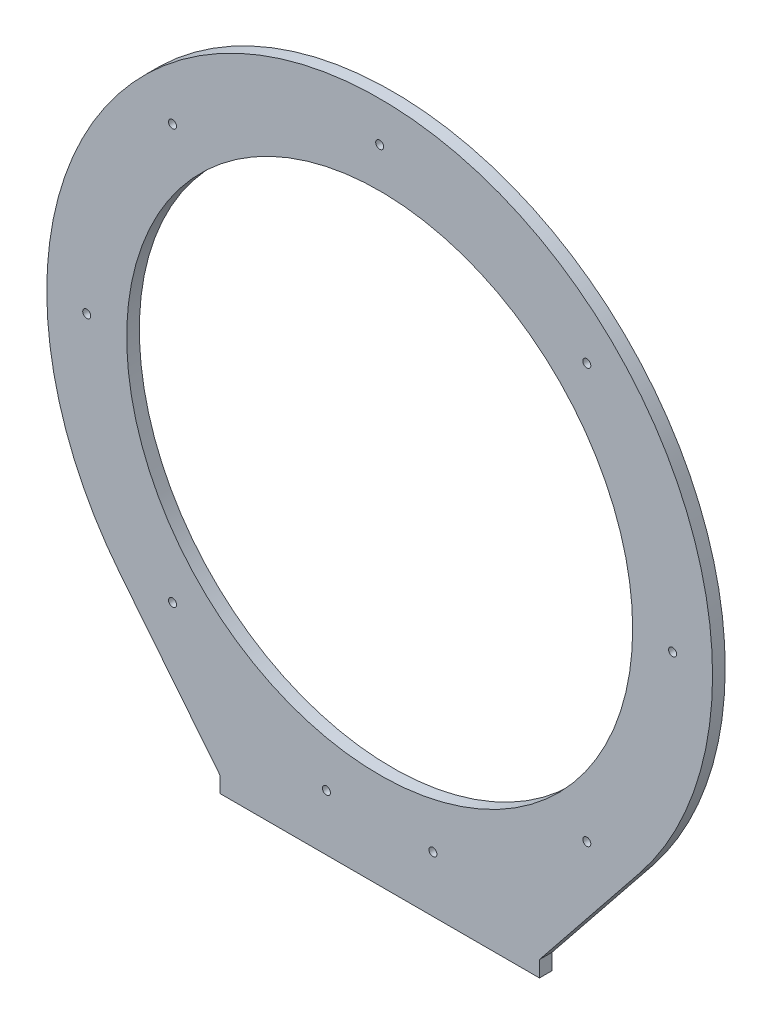
ISO-10303-21;
HEADER;
FILE_DESCRIPTION(('STEP AP214'),'2;1');
FILE_NAME('part.step','',(''),(''),'','','');
FILE_SCHEMA(('AUTOMOTIVE_DESIGN { 1 0 10303 214 1 1 1 1 }'));
ENDSEC;
DATA;
#1=APPLICATION_CONTEXT('core data for automotive mechanical design processes');
#2=APPLICATION_PROTOCOL_DEFINITION('international standard','automotive_design',2000,#1);
#3=PRODUCT_CONTEXT('',#1,'mechanical');
#4=PRODUCT('Part','Part','',(#3));
#5=PRODUCT_RELATED_PRODUCT_CATEGORY('part','',(#4));
#6=PRODUCT_DEFINITION_FORMATION('','',#4);
#7=PRODUCT_DEFINITION_CONTEXT('part definition',#1,'design');
#8=PRODUCT_DEFINITION('design','',#6,#7);
#9=PRODUCT_DEFINITION_SHAPE('','',#8);
#10=(LENGTH_UNIT() NAMED_UNIT(*) SI_UNIT(.MILLI.,.METRE.));
#11=(NAMED_UNIT(*) PLANE_ANGLE_UNIT() SI_UNIT($,.RADIAN.));
#12=(NAMED_UNIT(*) SI_UNIT($,.STERADIAN.) SOLID_ANGLE_UNIT());
#13=UNCERTAINTY_MEASURE_WITH_UNIT(LENGTH_MEASURE(1.E-05),#10,'distance_accuracy_value','');
#14=(GEOMETRIC_REPRESENTATION_CONTEXT(3) GLOBAL_UNCERTAINTY_ASSIGNED_CONTEXT((#13)) GLOBAL_UNIT_ASSIGNED_CONTEXT((#10,
#11,#12)) REPRESENTATION_CONTEXT('',''));
#15=CARTESIAN_POINT('',(0.,0.,0.));
#16=DIRECTION('',(0.,0.,1.));
#17=DIRECTION('',(1.,0.,0.));
#18=AXIS2_PLACEMENT_3D('',#15,#16,#17);
#19=CARTESIAN_POINT('',(97.5292587776334,-78.185955786736,4.75));
#20=DIRECTION('',(-0.780234070221067,0.625487646293888,0.));
#21=DIRECTION('',(-0.625487646293888,-0.780234070221067,0.));
#22=AXIS2_PLACEMENT_3D('',#19,#20,#21);
#23=PLANE('',#22);
#24=DIRECTION('',(0.625487646293888,0.780234070221067,0.));
#25=VECTOR('',#24,1.);
#26=CARTESIAN_POINT('',(97.5292587776334,-78.185955786736,0.));
#27=LINE('',#26,#25);
#28=CARTESIAN_POINT('',(60.0000000000001,-125.,0.));
#29=VERTEX_POINT('',#28);
#30=CARTESIAN_POINT('',(97.5292587776333,-78.1859557867361,0.));
#31=VERTEX_POINT('',#30);
#32=EDGE_CURVE('E162',#29,#31,#27,.T.);
#33=ORIENTED_EDGE('',*,*,#32,.T.);
#34=DIRECTION('',(0.,0.,-1.));
#35=VECTOR('',#34,1.);
#36=CARTESIAN_POINT('',(97.5292587776333,-78.1859557867361,4.75));
#37=LINE('',#36,#35);
#38=CARTESIAN_POINT('',(97.5292587776333,-78.1859557867361,4.75));
#39=VERTEX_POINT('',#38);
#40=EDGE_CURVE('E11',#39,#31,#37,.T.);
#41=ORIENTED_EDGE('',*,*,#40,.F.);
#42=DIRECTION('',(0.625487646293888,0.780234070221067,0.));
#43=VECTOR('',#42,1.);
#44=CARTESIAN_POINT('',(97.5292587776334,-78.185955786736,4.75));
#45=LINE('',#44,#43);
#46=CARTESIAN_POINT('',(60.0000000000001,-125.,4.75));
#47=VERTEX_POINT('',#46);
#48=EDGE_CURVE('E206',#47,#39,#45,.T.);
#49=ORIENTED_EDGE('',*,*,#48,.F.);
#50=DIRECTION('',(0.,0.,-1.));
#51=VECTOR('',#50,1.);
#52=CARTESIAN_POINT('',(60.0000000000001,-125.,4.75));
#53=LINE('',#52,#51);
#54=EDGE_CURVE('E63',#47,#29,#53,.T.);
#55=ORIENTED_EDGE('',*,*,#54,.T.);
#56=EDGE_LOOP('',(#33,#41,#49,#55));
#57=FACE_BOUND('',#56,.T.);
#58=ADVANCED_FACE('F47',(#57),#23,.F.);
#59=CARTESIAN_POINT('',(0.,0.,4.75));
#60=DIRECTION('',(0.,0.,-1.));
#61=DIRECTION('',(-1.,0.,0.));
#62=AXIS2_PLACEMENT_3D('',#59,#60,#61);
#63=CYLINDRICAL_SURFACE('',#62,125.);
#64=CARTESIAN_POINT('',(0.,0.,0.));
#65=DIRECTION('',(0.,0.,1.));
#66=DIRECTION('',(1.,0.,0.));
#67=AXIS2_PLACEMENT_3D('',#64,#65,#66);
#68=CIRCLE('',#67,125.);
#69=CARTESIAN_POINT('',(-97.5292587776333,-78.1859557867361,0.));
#70=VERTEX_POINT('',#69);
#71=EDGE_CURVE('E164',#31,#70,#68,.T.);
#72=ORIENTED_EDGE('',*,*,#71,.T.);
#73=DIRECTION('',(0.,0.,-1.));
#74=VECTOR('',#73,1.);
#75=CARTESIAN_POINT('',(-97.5292587776333,-78.1859557867361,4.75));
#76=LINE('',#75,#74);
#77=CARTESIAN_POINT('',(-97.5292587776333,-78.1859557867361,4.75));
#78=VERTEX_POINT('',#77);
#79=EDGE_CURVE('E55',#78,#70,#76,.T.);
#80=ORIENTED_EDGE('',*,*,#79,.F.);
#81=CARTESIAN_POINT('',(0.,0.,4.75));
#82=DIRECTION('',(0.,0.,1.));
#83=DIRECTION('',(1.,0.,0.));
#84=AXIS2_PLACEMENT_3D('',#81,#82,#83);
#85=CIRCLE('',#84,125.);
#86=EDGE_CURVE('E96',#39,#78,#85,.T.);
#87=ORIENTED_EDGE('',*,*,#86,.F.);
#88=ORIENTED_EDGE('',*,*,#40,.T.);
#89=EDGE_LOOP('',(#72,#80,#87,#88));
#90=FACE_BOUND('',#89,.T.);
#91=ADVANCED_FACE('F212',(#90),#63,.T.);
#92=CARTESIAN_POINT('',(-97.5292587776332,-78.1859557867361,4.75));
#93=DIRECTION('',(-0.780234070221066,-0.625487646293889,0.));
#94=DIRECTION('',(0.625487646293889,-0.780234070221066,0.));
#95=AXIS2_PLACEMENT_3D('',#92,#93,#94);
#96=PLANE('',#95);
#97=DIRECTION('',(-0.625487646293889,0.780234070221066,0.));
#98=VECTOR('',#97,1.);
#99=CARTESIAN_POINT('',(-97.5292587776332,-78.1859557867361,0.));
#100=LINE('',#99,#98);
#101=CARTESIAN_POINT('',(-59.9999999999999,-125.,0.));
#102=VERTEX_POINT('',#101);
#103=EDGE_CURVE('E167',#102,#70,#100,.T.);
#104=ORIENTED_EDGE('',*,*,#103,.F.);
#105=DIRECTION('',(0.,0.,-1.));
#106=VECTOR('',#105,1.);
#107=CARTESIAN_POINT('',(-59.9999999999999,-125.,4.75));
#108=LINE('',#107,#106);
#109=CARTESIAN_POINT('',(-59.9999999999999,-125.,4.75));
#110=VERTEX_POINT('',#109);
#111=EDGE_CURVE('E124',#110,#102,#108,.T.);
#112=ORIENTED_EDGE('',*,*,#111,.F.);
#113=DIRECTION('',(-0.625487646293889,0.780234070221066,0.));
#114=VECTOR('',#113,1.);
#115=CARTESIAN_POINT('',(-97.5292587776332,-78.1859557867361,4.75));
#116=LINE('',#115,#114);
#117=EDGE_CURVE('E114',#110,#78,#116,.T.);
#118=ORIENTED_EDGE('',*,*,#117,.T.);
#119=ORIENTED_EDGE('',*,*,#79,.T.);
#120=EDGE_LOOP('',(#104,#112,#118,#119));
#121=FACE_BOUND('',#120,.T.);
#122=ADVANCED_FACE('F211',(#121),#96,.T.);
#123=CARTESIAN_POINT('',(-59.9999999999999,0.,4.75));
#124=DIRECTION('',(1.,0.,0.));
#125=DIRECTION('',(0.,0.,-1.));
#126=AXIS2_PLACEMENT_3D('',#123,#124,#125);
#127=PLANE('',#126);
#128=DIRECTION('',(0.,-1.,0.));
#129=VECTOR('',#128,1.);
#130=CARTESIAN_POINT('',(-59.9999999999999,0.,0.));
#131=LINE('',#130,#129);
#132=CARTESIAN_POINT('',(-59.9999999999999,-131.,0.));
#133=VERTEX_POINT('',#132);
#134=EDGE_CURVE('E121',#102,#133,#131,.T.);
#135=ORIENTED_EDGE('',*,*,#134,.T.);
#136=DIRECTION('',(0.,0.,-1.));
#137=VECTOR('',#136,1.);
#138=CARTESIAN_POINT('',(-59.9999999999999,-131.,4.75));
#139=LINE('',#138,#137);
#140=CARTESIAN_POINT('',(-59.9999999999999,-131.,4.75));
#141=VERTEX_POINT('',#140);
#142=EDGE_CURVE('E118',#141,#133,#139,.T.);
#143=ORIENTED_EDGE('',*,*,#142,.F.);
#144=DIRECTION('',(0.,-1.,0.));
#145=VECTOR('',#144,1.);
#146=CARTESIAN_POINT('',(-59.9999999999999,0.,4.75));
#147=LINE('',#146,#145);
#148=EDGE_CURVE('E106',#110,#141,#147,.T.);
#149=ORIENTED_EDGE('',*,*,#148,.F.);
#150=ORIENTED_EDGE('',*,*,#111,.T.);
#151=EDGE_LOOP('',(#135,#143,#149,#150));
#152=FACE_BOUND('',#151,.T.);
#153=ADVANCED_FACE('F119',(#152),#127,.F.);
#154=CARTESIAN_POINT('',(0.,-131.,4.75));
#155=DIRECTION('',(0.,1.,0.));
#156=DIRECTION('',(0.,0.,1.));
#157=AXIS2_PLACEMENT_3D('',#154,#155,#156);
#158=PLANE('',#157);
#159=DIRECTION('',(1.,0.,0.));
#160=VECTOR('',#159,1.);
#161=CARTESIAN_POINT('',(0.,-131.,0.));
#162=LINE('',#161,#160);
#163=CARTESIAN_POINT('',(60.0000000000001,-131.,0.));
#164=VERTEX_POINT('',#163);
#165=EDGE_CURVE('E171',#133,#164,#162,.T.);
#166=ORIENTED_EDGE('',*,*,#165,.T.);
#167=DIRECTION('',(0.,0.,-1.));
#168=VECTOR('',#167,1.);
#169=CARTESIAN_POINT('',(60.0000000000001,-131.,4.75));
#170=LINE('',#169,#168);
#171=CARTESIAN_POINT('',(60.0000000000001,-131.,4.75));
#172=VERTEX_POINT('',#171);
#173=EDGE_CURVE('E84',#172,#164,#170,.T.);
#174=ORIENTED_EDGE('',*,*,#173,.F.);
#175=DIRECTION('',(1.,0.,0.));
#176=VECTOR('',#175,1.);
#177=CARTESIAN_POINT('',(0.,-131.,4.75));
#178=LINE('',#177,#176);
#179=EDGE_CURVE('E112',#141,#172,#178,.T.);
#180=ORIENTED_EDGE('',*,*,#179,.F.);
#181=ORIENTED_EDGE('',*,*,#142,.T.);
#182=EDGE_LOOP('',(#166,#174,#180,#181));
#183=FACE_BOUND('',#182,.T.);
#184=ADVANCED_FACE('F126',(#183),#158,.F.);
#185=CARTESIAN_POINT('',(-77.7817459305202,-77.7817459305202,4.75));
#186=DIRECTION('',(0.,0.,-1.));
#187=DIRECTION('',(-1.,0.,0.));
#188=AXIS2_PLACEMENT_3D('',#185,#186,#187);
#189=CYLINDRICAL_SURFACE('',#188,1.49999999999997);
#190=CARTESIAN_POINT('',(-77.7817459305202,-77.7817459305202,4.75));
#191=DIRECTION('',(0.,0.,1.));
#192=DIRECTION('',(1.,0.,0.));
#193=AXIS2_PLACEMENT_3D('',#190,#191,#192);
#194=CIRCLE('',#193,1.49999999999997);
#195=CARTESIAN_POINT('',(-76.2817459305202,-77.7817459305202,4.75));
#196=VERTEX_POINT('',#195);
#197=EDGE_CURVE('E156',#196,#196,#194,.F.);
#198=ORIENTED_EDGE('',*,*,#197,.F.);
#199=EDGE_LOOP('',(#198));
#200=FACE_BOUND('',#199,.T.);
#201=CARTESIAN_POINT('',(-77.7817459305202,-77.7817459305202,0.));
#202=DIRECTION('',(0.,0.,1.));
#203=DIRECTION('',(1.,0.,0.));
#204=AXIS2_PLACEMENT_3D('',#201,#202,#203);
#205=CIRCLE('',#204,1.49999999999997);
#206=CARTESIAN_POINT('',(-76.2817459305202,-77.7817459305202,0.));
#207=VERTEX_POINT('',#206);
#208=EDGE_CURVE('E200',#207,#207,#205,.F.);
#209=ORIENTED_EDGE('',*,*,#208,.T.);
#210=EDGE_LOOP('',(#209));
#211=FACE_BOUND('',#210,.T.);
#212=ADVANCED_FACE('F245',(#200,#211),#189,.F.);
#213=CARTESIAN_POINT('',(77.7817459305202,77.7817459305202,4.75));
#214=DIRECTION('',(0.,0.,-1.));
#215=DIRECTION('',(-1.,0.,0.));
#216=AXIS2_PLACEMENT_3D('',#213,#214,#215);
#217=CYLINDRICAL_SURFACE('',#216,1.5);
#218=CARTESIAN_POINT('',(77.7817459305202,77.7817459305202,4.75));
#219=DIRECTION('',(0.,0.,1.));
#220=DIRECTION('',(1.,0.,0.));
#221=AXIS2_PLACEMENT_3D('',#218,#219,#220);
#222=CIRCLE('',#221,1.5);
#223=CARTESIAN_POINT('',(79.2817459305202,77.7817459305202,4.75));
#224=VERTEX_POINT('',#223);
#225=EDGE_CURVE('E153',#224,#224,#222,.T.);
#226=ORIENTED_EDGE('',*,*,#225,.T.);
#227=EDGE_LOOP('',(#226));
#228=FACE_BOUND('',#227,.T.);
#229=CARTESIAN_POINT('',(77.7817459305202,77.7817459305202,0.));
#230=DIRECTION('',(0.,0.,1.));
#231=DIRECTION('',(1.,0.,0.));
#232=AXIS2_PLACEMENT_3D('',#229,#230,#231);
#233=CIRCLE('',#232,1.5);
#234=CARTESIAN_POINT('',(79.2817459305202,77.7817459305202,0.));
#235=VERTEX_POINT('',#234);
#236=EDGE_CURVE('E197',#235,#235,#233,.T.);
#237=ORIENTED_EDGE('',*,*,#236,.F.);
#238=EDGE_LOOP('',(#237));
#239=FACE_BOUND('',#238,.T.);
#240=ADVANCED_FACE('F249',(#228,#239),#217,.F.);
#241=CARTESIAN_POINT('',(77.7817459305203,-77.7817459305202,4.75));
#242=DIRECTION('',(0.,0.,-1.));
#243=DIRECTION('',(-1.,0.,0.));
#244=AXIS2_PLACEMENT_3D('',#241,#242,#243);
#245=CYLINDRICAL_SURFACE('',#244,1.5);
#246=CARTESIAN_POINT('',(77.7817459305203,-77.7817459305202,4.75));
#247=DIRECTION('',(0.,0.,1.));
#248=DIRECTION('',(1.,0.,0.));
#249=AXIS2_PLACEMENT_3D('',#246,#247,#248);
#250=CIRCLE('',#249,1.5);
#251=CARTESIAN_POINT('',(79.2817459305203,-77.7817459305202,4.75));
#252=VERTEX_POINT('',#251);
#253=EDGE_CURVE('E150',#252,#252,#250,.T.);
#254=ORIENTED_EDGE('',*,*,#253,.T.);
#255=EDGE_LOOP('',(#254));
#256=FACE_BOUND('',#255,.T.);
#257=CARTESIAN_POINT('',(77.7817459305203,-77.7817459305202,0.));
#258=DIRECTION('',(0.,0.,1.));
#259=DIRECTION('',(1.,0.,0.));
#260=AXIS2_PLACEMENT_3D('',#257,#258,#259);
#261=CIRCLE('',#260,1.5);
#262=CARTESIAN_POINT('',(79.2817459305203,-77.7817459305202,0.));
#263=VERTEX_POINT('',#262);
#264=EDGE_CURVE('E194',#263,#263,#261,.T.);
#265=ORIENTED_EDGE('',*,*,#264,.F.);
#266=EDGE_LOOP('',(#265));
#267=FACE_BOUND('',#266,.T.);
#268=ADVANCED_FACE('F255',(#256,#267),#245,.F.);
#269=CARTESIAN_POINT('',(0.,110.,4.75));
#270=DIRECTION('',(0.,0.,-1.));
#271=DIRECTION('',(-1.,0.,0.));
#272=AXIS2_PLACEMENT_3D('',#269,#270,#271);
#273=CYLINDRICAL_SURFACE('',#272,1.5);
#274=CARTESIAN_POINT('',(0.,110.,4.75));
#275=DIRECTION('',(0.,0.,1.));
#276=DIRECTION('',(1.,0.,0.));
#277=AXIS2_PLACEMENT_3D('',#274,#275,#276);
#278=CIRCLE('',#277,1.5);
#279=CARTESIAN_POINT('',(1.5,110.,4.75));
#280=VERTEX_POINT('',#279);
#281=EDGE_CURVE('E147',#280,#280,#278,.F.);
#282=ORIENTED_EDGE('',*,*,#281,.F.);
#283=EDGE_LOOP('',(#282));
#284=FACE_BOUND('',#283,.T.);
#285=CARTESIAN_POINT('',(0.,110.,0.));
#286=DIRECTION('',(0.,0.,1.));
#287=DIRECTION('',(1.,0.,0.));
#288=AXIS2_PLACEMENT_3D('',#285,#286,#287);
#289=CIRCLE('',#288,1.5);
#290=CARTESIAN_POINT('',(1.5,110.,0.));
#291=VERTEX_POINT('',#290);
#292=EDGE_CURVE('E191',#291,#291,#289,.F.);
#293=ORIENTED_EDGE('',*,*,#292,.T.);
#294=EDGE_LOOP('',(#293));
#295=FACE_BOUND('',#294,.T.);
#296=ADVANCED_FACE('F264',(#284,#295),#273,.F.);
#297=CARTESIAN_POINT('',(110.,0.,4.75));
#298=DIRECTION('',(0.,0.,-1.));
#299=DIRECTION('',(-1.,0.,0.));
#300=AXIS2_PLACEMENT_3D('',#297,#298,#299);
#301=CYLINDRICAL_SURFACE('',#300,1.5);
#302=CARTESIAN_POINT('',(110.,0.,4.75));
#303=DIRECTION('',(0.,0.,1.));
#304=DIRECTION('',(1.,0.,0.));
#305=AXIS2_PLACEMENT_3D('',#302,#303,#304);
#306=CIRCLE('',#305,1.5);
#307=CARTESIAN_POINT('',(111.5,0.,4.75));
#308=VERTEX_POINT('',#307);
#309=EDGE_CURVE('E144',#308,#308,#306,.T.);
#310=ORIENTED_EDGE('',*,*,#309,.T.);
#311=EDGE_LOOP('',(#310));
#312=FACE_BOUND('',#311,.T.);
#313=CARTESIAN_POINT('',(110.,0.,0.));
#314=DIRECTION('',(0.,0.,1.));
#315=DIRECTION('',(1.,0.,0.));
#316=AXIS2_PLACEMENT_3D('',#313,#314,#315);
#317=CIRCLE('',#316,1.5);
#318=CARTESIAN_POINT('',(111.5,0.,0.));
#319=VERTEX_POINT('',#318);
#320=EDGE_CURVE('E188',#319,#319,#317,.T.);
#321=ORIENTED_EDGE('',*,*,#320,.F.);
#322=EDGE_LOOP('',(#321));
#323=FACE_BOUND('',#322,.T.);
#324=ADVANCED_FACE('F268',(#312,#323),#301,.F.);
#325=CARTESIAN_POINT('',(-110.,0.,4.75));
#326=DIRECTION('',(0.,0.,-1.));
#327=DIRECTION('',(-1.,0.,0.));
#328=AXIS2_PLACEMENT_3D('',#325,#326,#327);
#329=CYLINDRICAL_SURFACE('',#328,1.5);
#330=CARTESIAN_POINT('',(-110.,0.,4.75));
#331=DIRECTION('',(0.,0.,1.));
#332=DIRECTION('',(1.,0.,0.));
#333=AXIS2_PLACEMENT_3D('',#330,#331,#332);
#334=CIRCLE('',#333,1.5);
#335=CARTESIAN_POINT('',(-108.5,0.,4.75));
#336=VERTEX_POINT('',#335);
#337=EDGE_CURVE('E141',#336,#336,#334,.F.);
#338=ORIENTED_EDGE('',*,*,#337,.F.);
#339=EDGE_LOOP('',(#338));
#340=FACE_BOUND('',#339,.T.);
#341=CARTESIAN_POINT('',(-110.,0.,0.));
#342=DIRECTION('',(0.,0.,1.));
#343=DIRECTION('',(1.,0.,0.));
#344=AXIS2_PLACEMENT_3D('',#341,#342,#343);
#345=CIRCLE('',#344,1.5);
#346=CARTESIAN_POINT('',(-108.5,0.,0.));
#347=VERTEX_POINT('',#346);
#348=EDGE_CURVE('E185',#347,#347,#345,.F.);
#349=ORIENTED_EDGE('',*,*,#348,.T.);
#350=EDGE_LOOP('',(#349));
#351=FACE_BOUND('',#350,.T.);
#352=ADVANCED_FACE('F272',(#340,#351),#329,.F.);
#353=CARTESIAN_POINT('',(0.,0.,4.75));
#354=DIRECTION('',(0.,0.,-1.));
#355=DIRECTION('',(-1.,0.,0.));
#356=AXIS2_PLACEMENT_3D('',#353,#354,#355);
#357=CYLINDRICAL_SURFACE('',#356,95.);
#358=CARTESIAN_POINT('',(0.,0.,4.75));
#359=DIRECTION('',(0.,0.,1.));
#360=DIRECTION('',(1.,0.,0.));
#361=AXIS2_PLACEMENT_3D('',#358,#359,#360);
#362=CIRCLE('',#361,95.);
#363=CARTESIAN_POINT('',(95.,0.,4.75));
#364=VERTEX_POINT('',#363);
#365=EDGE_CURVE('E138',#364,#364,#362,.T.);
#366=ORIENTED_EDGE('',*,*,#365,.T.);
#367=EDGE_LOOP('',(#366));
#368=FACE_BOUND('',#367,.T.);
#369=CARTESIAN_POINT('',(0.,0.,0.));
#370=DIRECTION('',(0.,0.,1.));
#371=DIRECTION('',(1.,0.,0.));
#372=AXIS2_PLACEMENT_3D('',#369,#370,#371);
#373=CIRCLE('',#372,95.);
#374=CARTESIAN_POINT('',(95.,0.,0.));
#375=VERTEX_POINT('',#374);
#376=EDGE_CURVE('E182',#375,#375,#373,.T.);
#377=ORIENTED_EDGE('',*,*,#376,.F.);
#378=EDGE_LOOP('',(#377));
#379=FACE_BOUND('',#378,.T.);
#380=ADVANCED_FACE('F276',(#368,#379),#357,.F.);
#381=CARTESIAN_POINT('',(-19.9999999999995,-110.,4.75));
#382=DIRECTION('',(0.,0.,-1.));
#383=DIRECTION('',(-1.,0.,0.));
#384=AXIS2_PLACEMENT_3D('',#381,#382,#383);
#385=CYLINDRICAL_SURFACE('',#384,1.5);
#386=CARTESIAN_POINT('',(-19.9999999999995,-110.,4.75));
#387=DIRECTION('',(0.,0.,1.));
#388=DIRECTION('',(1.,0.,0.));
#389=AXIS2_PLACEMENT_3D('',#386,#387,#388);
#390=CIRCLE('',#389,1.5);
#391=CARTESIAN_POINT('',(-18.4999999999995,-110.,4.75));
#392=VERTEX_POINT('',#391);
#393=EDGE_CURVE('E135',#392,#392,#390,.T.);
#394=ORIENTED_EDGE('',*,*,#393,.T.);
#395=EDGE_LOOP('',(#394));
#396=FACE_BOUND('',#395,.T.);
#397=CARTESIAN_POINT('',(-19.9999999999995,-110.,0.));
#398=DIRECTION('',(0.,0.,1.));
#399=DIRECTION('',(1.,0.,0.));
#400=AXIS2_PLACEMENT_3D('',#397,#398,#399);
#401=CIRCLE('',#400,1.5);
#402=CARTESIAN_POINT('',(-18.4999999999995,-110.,0.));
#403=VERTEX_POINT('',#402);
#404=EDGE_CURVE('E179',#403,#403,#401,.T.);
#405=ORIENTED_EDGE('',*,*,#404,.F.);
#406=EDGE_LOOP('',(#405));
#407=FACE_BOUND('',#406,.T.);
#408=ADVANCED_FACE('F228',(#396,#407),#385,.F.);
#409=CARTESIAN_POINT('',(20.0000000000004,-110.,4.75));
#410=DIRECTION('',(0.,0.,-1.));
#411=DIRECTION('',(-1.,0.,0.));
#412=AXIS2_PLACEMENT_3D('',#409,#410,#411);
#413=CYLINDRICAL_SURFACE('',#412,1.5);
#414=CARTESIAN_POINT('',(20.0000000000004,-110.,4.75));
#415=DIRECTION('',(0.,0.,1.));
#416=DIRECTION('',(1.,0.,0.));
#417=AXIS2_PLACEMENT_3D('',#414,#415,#416);
#418=CIRCLE('',#417,1.5);
#419=CARTESIAN_POINT('',(21.5000000000005,-110.,4.75));
#420=VERTEX_POINT('',#419);
#421=EDGE_CURVE('E129',#420,#420,#418,.T.);
#422=ORIENTED_EDGE('',*,*,#421,.T.);
#423=EDGE_LOOP('',(#422));
#424=FACE_BOUND('',#423,.T.);
#425=CARTESIAN_POINT('',(20.0000000000004,-110.,0.));
#426=DIRECTION('',(0.,0.,1.));
#427=DIRECTION('',(1.,0.,0.));
#428=AXIS2_PLACEMENT_3D('',#425,#426,#427);
#429=CIRCLE('',#428,1.5);
#430=CARTESIAN_POINT('',(21.5000000000005,-110.,0.));
#431=VERTEX_POINT('',#430);
#432=EDGE_CURVE('E176',#431,#431,#429,.T.);
#433=ORIENTED_EDGE('',*,*,#432,.F.);
#434=EDGE_LOOP('',(#433));
#435=FACE_BOUND('',#434,.T.);
#436=ADVANCED_FACE('F220',(#424,#435),#413,.F.);
#437=CARTESIAN_POINT('',(60.0000000000001,0.,4.75));
#438=DIRECTION('',(1.,0.,0.));
#439=DIRECTION('',(0.,0.,-1.));
#440=AXIS2_PLACEMENT_3D('',#437,#438,#439);
#441=PLANE('',#440);
#442=DIRECTION('',(0.,-1.,0.));
#443=VECTOR('',#442,1.);
#444=CARTESIAN_POINT('',(60.0000000000001,0.,0.));
#445=LINE('',#444,#443);
#446=EDGE_CURVE('E173',#29,#164,#445,.T.);
#447=ORIENTED_EDGE('',*,*,#446,.F.);
#448=ORIENTED_EDGE('',*,*,#54,.F.);
#449=DIRECTION('',(0.,-1.,0.));
#450=VECTOR('',#449,1.);
#451=CARTESIAN_POINT('',(60.0000000000001,0.,4.75));
#452=LINE('',#451,#450);
#453=EDGE_CURVE('E127',#47,#172,#452,.T.);
#454=ORIENTED_EDGE('',*,*,#453,.T.);
#455=ORIENTED_EDGE('',*,*,#173,.T.);
#456=EDGE_LOOP('',(#447,#448,#454,#455));
#457=FACE_BOUND('',#456,.T.);
#458=ADVANCED_FACE('F217',(#457),#441,.T.);
#459=CARTESIAN_POINT('',(-77.7817459305202,77.7817459305202,4.75));
#460=DIRECTION('',(0.,0.,-1.));
#461=DIRECTION('',(-1.,0.,0.));
#462=AXIS2_PLACEMENT_3D('',#459,#460,#461);
#463=CYLINDRICAL_SURFACE('',#462,1.49999999999998);
#464=CARTESIAN_POINT('',(-77.7817459305202,77.7817459305202,4.75));
#465=DIRECTION('',(0.,0.,1.));
#466=DIRECTION('',(1.,0.,0.));
#467=AXIS2_PLACEMENT_3D('',#464,#465,#466);
#468=CIRCLE('',#467,1.49999999999998);
#469=CARTESIAN_POINT('',(-76.2817459305202,77.7817459305202,4.75));
#470=VERTEX_POINT('',#469);
#471=EDGE_CURVE('E159',#470,#470,#468,.F.);
#472=ORIENTED_EDGE('',*,*,#471,.F.);
#473=EDGE_LOOP('',(#472));
#474=FACE_BOUND('',#473,.T.);
#475=CARTESIAN_POINT('',(-77.7817459305202,77.7817459305202,0.));
#476=DIRECTION('',(0.,0.,1.));
#477=DIRECTION('',(1.,0.,0.));
#478=AXIS2_PLACEMENT_3D('',#475,#476,#477);
#479=CIRCLE('',#478,1.49999999999998);
#480=CARTESIAN_POINT('',(-76.2817459305202,77.7817459305202,0.));
#481=VERTEX_POINT('',#480);
#482=EDGE_CURVE('E203',#481,#481,#479,.F.);
#483=ORIENTED_EDGE('',*,*,#482,.T.);
#484=EDGE_LOOP('',(#483));
#485=FACE_BOUND('',#484,.T.);
#486=ADVANCED_FACE('F219',(#474,#485),#463,.F.);
#487=CARTESIAN_POINT('',(0.,0.,4.75));
#488=DIRECTION('',(0.,0.,1.));
#489=DIRECTION('',(1.,0.,0.));
#490=AXIS2_PLACEMENT_3D('',#487,#488,#489);
#491=PLANE('',#490);
#492=ORIENTED_EDGE('',*,*,#48,.T.);
#493=ORIENTED_EDGE('',*,*,#86,.T.);
#494=ORIENTED_EDGE('',*,*,#117,.F.);
#495=ORIENTED_EDGE('',*,*,#148,.T.);
#496=ORIENTED_EDGE('',*,*,#179,.T.);
#497=ORIENTED_EDGE('',*,*,#453,.F.);
#498=EDGE_LOOP('',(#492,#493,#494,#495,#496,#497));
#499=FACE_BOUND('',#498,.T.);
#500=ORIENTED_EDGE('',*,*,#421,.F.);
#501=EDGE_LOOP('',(#500));
#502=FACE_BOUND('',#501,.T.);
#503=ORIENTED_EDGE('',*,*,#393,.F.);
#504=EDGE_LOOP('',(#503));
#505=FACE_BOUND('',#504,.T.);
#506=ORIENTED_EDGE('',*,*,#365,.F.);
#507=EDGE_LOOP('',(#506));
#508=FACE_BOUND('',#507,.T.);
#509=ORIENTED_EDGE('',*,*,#337,.T.);
#510=EDGE_LOOP('',(#509));
#511=FACE_BOUND('',#510,.T.);
#512=ORIENTED_EDGE('',*,*,#309,.F.);
#513=EDGE_LOOP('',(#512));
#514=FACE_BOUND('',#513,.T.);
#515=ORIENTED_EDGE('',*,*,#281,.T.);
#516=EDGE_LOOP('',(#515));
#517=FACE_BOUND('',#516,.T.);
#518=ORIENTED_EDGE('',*,*,#253,.F.);
#519=EDGE_LOOP('',(#518));
#520=FACE_BOUND('',#519,.T.);
#521=ORIENTED_EDGE('',*,*,#225,.F.);
#522=EDGE_LOOP('',(#521));
#523=FACE_BOUND('',#522,.T.);
#524=ORIENTED_EDGE('',*,*,#197,.T.);
#525=EDGE_LOOP('',(#524));
#526=FACE_BOUND('',#525,.T.);
#527=ORIENTED_EDGE('',*,*,#471,.T.);
#528=EDGE_LOOP('',(#527));
#529=FACE_BOUND('',#528,.T.);
#530=ADVANCED_FACE('F108',(#499,#502,#505,#508,#511,#514,#517,#520,#523,#526,#529),#491,.T.);
#531=CARTESIAN_POINT('',(0.,0.,0.));
#532=DIRECTION('',(0.,0.,1.));
#533=DIRECTION('',(1.,0.,0.));
#534=AXIS2_PLACEMENT_3D('',#531,#532,#533);
#535=PLANE('',#534);
#536=ORIENTED_EDGE('',*,*,#32,.F.);
#537=ORIENTED_EDGE('',*,*,#446,.T.);
#538=ORIENTED_EDGE('',*,*,#165,.F.);
#539=ORIENTED_EDGE('',*,*,#134,.F.);
#540=ORIENTED_EDGE('',*,*,#103,.T.);
#541=ORIENTED_EDGE('',*,*,#71,.F.);
#542=EDGE_LOOP('',(#536,#537,#538,#539,#540,#541));
#543=FACE_BOUND('',#542,.T.);
#544=ORIENTED_EDGE('',*,*,#432,.T.);
#545=EDGE_LOOP('',(#544));
#546=FACE_BOUND('',#545,.T.);
#547=ORIENTED_EDGE('',*,*,#404,.T.);
#548=EDGE_LOOP('',(#547));
#549=FACE_BOUND('',#548,.T.);
#550=ORIENTED_EDGE('',*,*,#376,.T.);
#551=EDGE_LOOP('',(#550));
#552=FACE_BOUND('',#551,.T.);
#553=ORIENTED_EDGE('',*,*,#348,.F.);
#554=EDGE_LOOP('',(#553));
#555=FACE_BOUND('',#554,.T.);
#556=ORIENTED_EDGE('',*,*,#320,.T.);
#557=EDGE_LOOP('',(#556));
#558=FACE_BOUND('',#557,.T.);
#559=ORIENTED_EDGE('',*,*,#292,.F.);
#560=EDGE_LOOP('',(#559));
#561=FACE_BOUND('',#560,.T.);
#562=ORIENTED_EDGE('',*,*,#264,.T.);
#563=EDGE_LOOP('',(#562));
#564=FACE_BOUND('',#563,.T.);
#565=ORIENTED_EDGE('',*,*,#236,.T.);
#566=EDGE_LOOP('',(#565));
#567=FACE_BOUND('',#566,.T.);
#568=ORIENTED_EDGE('',*,*,#208,.F.);
#569=EDGE_LOOP('',(#568));
#570=FACE_BOUND('',#569,.T.);
#571=ORIENTED_EDGE('',*,*,#482,.F.);
#572=EDGE_LOOP('',(#571));
#573=FACE_BOUND('',#572,.T.);
#574=ADVANCED_FACE('F215',(#543,#546,#549,#552,#555,#558,#561,#564,#567,#570,#573),#535,.F.);
#575=CLOSED_SHELL('',(#58,#91,#122,#153,#184,#212,#240,#268,#296,#324,#352,#380,#408,#436,#458,
#486,#530,#574));
#576=MANIFOLD_SOLID_BREP('B2',#575);
#577=ADVANCED_BREP_SHAPE_REPRESENTATION('',(#18,#576),#14);
#578=SHAPE_DEFINITION_REPRESENTATION(#9,#577);
ENDSEC;
END-ISO-10303-21;
